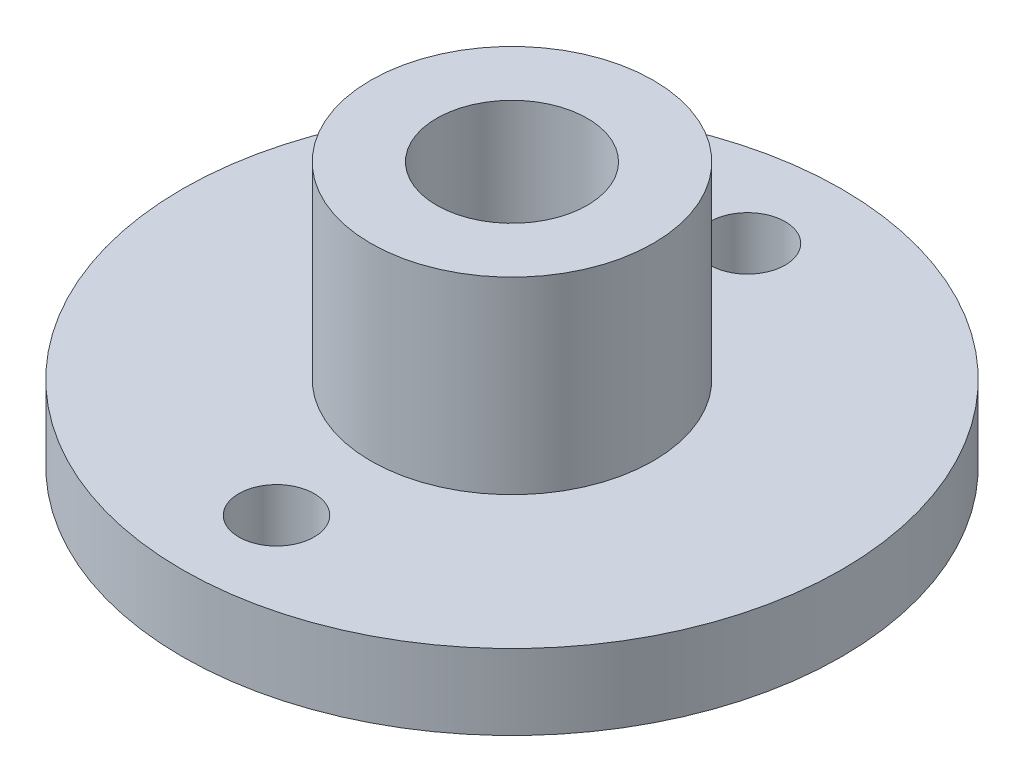
ISO-10303-21;
HEADER;
FILE_DESCRIPTION(('STEP AP214'),'2;1');
FILE_NAME('part.step','',(''),(''),'','','');
FILE_SCHEMA(('AUTOMOTIVE_DESIGN { 1 0 10303 214 1 1 1 1 }'));
ENDSEC;
DATA;
#1=APPLICATION_CONTEXT('core data for automotive mechanical design processes');
#2=APPLICATION_PROTOCOL_DEFINITION('international standard','automotive_design',2000,#1);
#3=PRODUCT_CONTEXT('',#1,'mechanical');
#4=PRODUCT('Part','Part','',(#3));
#5=PRODUCT_RELATED_PRODUCT_CATEGORY('part','',(#4));
#6=PRODUCT_DEFINITION_FORMATION('','',#4);
#7=PRODUCT_DEFINITION_CONTEXT('part definition',#1,'design');
#8=PRODUCT_DEFINITION('design','',#6,#7);
#9=PRODUCT_DEFINITION_SHAPE('','',#8);
#10=(LENGTH_UNIT() NAMED_UNIT(*) SI_UNIT(.MILLI.,.METRE.));
#11=(NAMED_UNIT(*) PLANE_ANGLE_UNIT() SI_UNIT($,.RADIAN.));
#12=(NAMED_UNIT(*) SI_UNIT($,.STERADIAN.) SOLID_ANGLE_UNIT());
#13=UNCERTAINTY_MEASURE_WITH_UNIT(LENGTH_MEASURE(1.E-05),#10,'distance_accuracy_value','');
#14=(GEOMETRIC_REPRESENTATION_CONTEXT(3) GLOBAL_UNCERTAINTY_ASSIGNED_CONTEXT((#13)) GLOBAL_UNIT_ASSIGNED_CONTEXT((#10,
#11,#12)) REPRESENTATION_CONTEXT('',''));
#15=CARTESIAN_POINT('',(0.,0.,0.));
#16=DIRECTION('',(0.,0.,1.));
#17=DIRECTION('',(1.,0.,0.));
#18=AXIS2_PLACEMENT_3D('',#15,#16,#17);
#19=CARTESIAN_POINT('',(0.,4.,0.));
#20=DIRECTION('',(0.,1.,0.));
#21=DIRECTION('',(0.,0.,1.));
#22=AXIS2_PLACEMENT_3D('',#19,#20,#21);
#23=PLANE('',#22);
#24=CARTESIAN_POINT('',(0.,4.,0.));
#25=DIRECTION('',(0.,1.,0.));
#26=DIRECTION('',(0.,0.,1.));
#27=AXIS2_PLACEMENT_3D('',#24,#25,#26);
#28=CIRCLE('',#27,7.5);
#29=CARTESIAN_POINT('',(0.,4.,7.5));
#30=VERTEX_POINT('',#29);
#31=EDGE_CURVE('E64',#30,#30,#28,.T.);
#32=ORIENTED_EDGE('',*,*,#31,.F.);
#33=EDGE_LOOP('',(#32));
#34=FACE_BOUND('',#33,.T.);
#35=CARTESIAN_POINT('',(0.,4.,-12.5));
#36=DIRECTION('',(0.,1.,0.));
#37=DIRECTION('',(0.,0.,1.));
#38=AXIS2_PLACEMENT_3D('',#35,#36,#37);
#39=CIRCLE('',#38,2.);
#40=CARTESIAN_POINT('',(0.,4.,-10.5));
#41=VERTEX_POINT('',#40);
#42=EDGE_CURVE('E50',#41,#41,#39,.T.);
#43=ORIENTED_EDGE('',*,*,#42,.F.);
#44=EDGE_LOOP('',(#43));
#45=FACE_BOUND('',#44,.T.);
#46=CARTESIAN_POINT('',(0.,4.,0.));
#47=DIRECTION('',(0.,1.,0.));
#48=DIRECTION('',(0.,0.,1.));
#49=AXIS2_PLACEMENT_3D('',#46,#47,#48);
#50=CIRCLE('',#49,17.5);
#51=CARTESIAN_POINT('',(0.,4.,17.5));
#52=VERTEX_POINT('',#51);
#53=EDGE_CURVE('E41',#52,#52,#50,.T.);
#54=ORIENTED_EDGE('',*,*,#53,.T.);
#55=EDGE_LOOP('',(#54));
#56=FACE_BOUND('',#55,.T.);
#57=CARTESIAN_POINT('',(0.,4.,12.5));
#58=DIRECTION('',(0.,1.,0.));
#59=DIRECTION('',(0.,0.,1.));
#60=AXIS2_PLACEMENT_3D('',#57,#58,#59);
#61=CIRCLE('',#60,2.);
#62=CARTESIAN_POINT('',(0.,4.,14.5));
#63=VERTEX_POINT('',#62);
#64=EDGE_CURVE('E55',#63,#63,#61,.T.);
#65=ORIENTED_EDGE('',*,*,#64,.F.);
#66=EDGE_LOOP('',(#65));
#67=FACE_BOUND('',#66,.T.);
#68=ADVANCED_FACE('F34',(#34,#45,#56,#67),#23,.T.);
#69=CARTESIAN_POINT('',(0.,0.,0.));
#70=DIRECTION('',(0.,1.,0.));
#71=DIRECTION('',(0.,0.,1.));
#72=AXIS2_PLACEMENT_3D('',#69,#70,#71);
#73=PLANE('',#72);
#74=CARTESIAN_POINT('',(0.,0.,0.));
#75=DIRECTION('',(0.,1.,0.));
#76=DIRECTION('',(0.,0.,1.));
#77=AXIS2_PLACEMENT_3D('',#74,#75,#76);
#78=CIRCLE('',#77,17.5);
#79=CARTESIAN_POINT('',(0.,0.,17.5));
#80=VERTEX_POINT('',#79);
#81=EDGE_CURVE('E45',#80,#80,#78,.T.);
#82=ORIENTED_EDGE('',*,*,#81,.F.);
#83=EDGE_LOOP('',(#82));
#84=FACE_BOUND('',#83,.T.);
#85=CARTESIAN_POINT('',(0.,0.,-12.5));
#86=DIRECTION('',(0.,1.,0.));
#87=DIRECTION('',(0.,0.,1.));
#88=AXIS2_PLACEMENT_3D('',#85,#86,#87);
#89=CIRCLE('',#88,2.);
#90=CARTESIAN_POINT('',(0.,0.,-10.5));
#91=VERTEX_POINT('',#90);
#92=EDGE_CURVE('E52',#91,#91,#89,.T.);
#93=ORIENTED_EDGE('',*,*,#92,.T.);
#94=EDGE_LOOP('',(#93));
#95=FACE_BOUND('',#94,.T.);
#96=CARTESIAN_POINT('',(0.,0.,12.5));
#97=DIRECTION('',(0.,1.,0.));
#98=DIRECTION('',(0.,0.,1.));
#99=AXIS2_PLACEMENT_3D('',#96,#97,#98);
#100=CIRCLE('',#99,2.);
#101=CARTESIAN_POINT('',(0.,0.,14.5));
#102=VERTEX_POINT('',#101);
#103=EDGE_CURVE('E58',#102,#102,#100,.T.);
#104=ORIENTED_EDGE('',*,*,#103,.T.);
#105=EDGE_LOOP('',(#104));
#106=FACE_BOUND('',#105,.T.);
#107=ADVANCED_FACE('F92',(#84,#95,#106),#73,.F.);
#108=CARTESIAN_POINT('',(0.,4.,0.));
#109=DIRECTION('',(0.,-1.,0.));
#110=DIRECTION('',(0.,0.,-1.));
#111=AXIS2_PLACEMENT_3D('',#108,#109,#110);
#112=CYLINDRICAL_SURFACE('',#111,17.5);
#113=ORIENTED_EDGE('',*,*,#53,.F.);
#114=EDGE_LOOP('',(#113));
#115=FACE_BOUND('',#114,.T.);
#116=ORIENTED_EDGE('',*,*,#81,.T.);
#117=EDGE_LOOP('',(#116));
#118=FACE_BOUND('',#117,.T.);
#119=ADVANCED_FACE('F36',(#115,#118),#112,.T.);
#120=CARTESIAN_POINT('',(0.,4.,-12.5));
#121=DIRECTION('',(0.,-1.,0.));
#122=DIRECTION('',(0.,0.,-1.));
#123=AXIS2_PLACEMENT_3D('',#120,#121,#122);
#124=CYLINDRICAL_SURFACE('',#123,2.);
#125=ORIENTED_EDGE('',*,*,#42,.T.);
#126=EDGE_LOOP('',(#125));
#127=FACE_BOUND('',#126,.T.);
#128=ORIENTED_EDGE('',*,*,#92,.F.);
#129=EDGE_LOOP('',(#128));
#130=FACE_BOUND('',#129,.T.);
#131=ADVANCED_FACE('F87',(#127,#130),#124,.F.);
#132=CARTESIAN_POINT('',(0.,4.,12.5));
#133=DIRECTION('',(0.,-1.,0.));
#134=DIRECTION('',(0.,0.,-1.));
#135=AXIS2_PLACEMENT_3D('',#132,#133,#134);
#136=CYLINDRICAL_SURFACE('',#135,2.);
#137=ORIENTED_EDGE('',*,*,#64,.T.);
#138=EDGE_LOOP('',(#137));
#139=FACE_BOUND('',#138,.T.);
#140=ORIENTED_EDGE('',*,*,#103,.F.);
#141=EDGE_LOOP('',(#140));
#142=FACE_BOUND('',#141,.T.);
#143=ADVANCED_FACE('F78',(#139,#142),#136,.F.);
#144=CARTESIAN_POINT('',(0.,14.,0.));
#145=DIRECTION('',(0.,1.,0.));
#146=DIRECTION('',(0.,0.,1.));
#147=AXIS2_PLACEMENT_3D('',#144,#145,#146);
#148=PLANE('',#147);
#149=CARTESIAN_POINT('',(0.,14.,0.));
#150=DIRECTION('',(0.,1.,0.));
#151=DIRECTION('',(0.,0.,1.));
#152=AXIS2_PLACEMENT_3D('',#149,#150,#151);
#153=CIRCLE('',#152,7.5);
#154=CARTESIAN_POINT('',(0.,14.,7.5));
#155=VERTEX_POINT('',#154);
#156=EDGE_CURVE('E61',#155,#155,#153,.T.);
#157=ORIENTED_EDGE('',*,*,#156,.T.);
#158=EDGE_LOOP('',(#157));
#159=FACE_BOUND('',#158,.T.);
#160=CARTESIAN_POINT('',(0.,14.,0.));
#161=DIRECTION('',(0.,1.,0.));
#162=DIRECTION('',(0.,0.,1.));
#163=AXIS2_PLACEMENT_3D('',#160,#161,#162);
#164=CIRCLE('',#163,4.);
#165=CARTESIAN_POINT('',(0.,14.,4.));
#166=VERTEX_POINT('',#165);
#167=EDGE_CURVE('E67',#166,#166,#164,.T.);
#168=ORIENTED_EDGE('',*,*,#167,.F.);
#169=EDGE_LOOP('',(#168));
#170=FACE_BOUND('',#169,.T.);
#171=ADVANCED_FACE('F75',(#159,#170),#148,.T.);
#172=CARTESIAN_POINT('',(0.,14.,0.));
#173=DIRECTION('',(0.,-1.,0.));
#174=DIRECTION('',(0.,0.,-1.));
#175=AXIS2_PLACEMENT_3D('',#172,#173,#174);
#176=CYLINDRICAL_SURFACE('',#175,7.5);
#177=ORIENTED_EDGE('',*,*,#156,.F.);
#178=EDGE_LOOP('',(#177));
#179=FACE_BOUND('',#178,.T.);
#180=ORIENTED_EDGE('',*,*,#31,.T.);
#181=EDGE_LOOP('',(#180));
#182=FACE_BOUND('',#181,.T.);
#183=ADVANCED_FACE('F77',(#179,#182),#176,.T.);
#184=CARTESIAN_POINT('',(0.,14.,0.));
#185=DIRECTION('',(0.,-1.,0.));
#186=DIRECTION('',(0.,0.,-1.));
#187=AXIS2_PLACEMENT_3D('',#184,#185,#186);
#188=CYLINDRICAL_SURFACE('',#187,4.);
#189=ORIENTED_EDGE('',*,*,#167,.T.);
#190=EDGE_LOOP('',(#189));
#191=FACE_BOUND('',#190,.T.);
#192=CARTESIAN_POINT('',(0.,4.,0.));
#193=DIRECTION('',(0.,1.,0.));
#194=DIRECTION('',(0.,0.,1.));
#195=AXIS2_PLACEMENT_3D('',#192,#193,#194);
#196=CIRCLE('',#195,4.);
#197=CARTESIAN_POINT('',(0.,4.,4.));
#198=VERTEX_POINT('',#197);
#199=EDGE_CURVE('E10',#198,#198,#196,.F.);
#200=ORIENTED_EDGE('',*,*,#199,.T.);
#201=EDGE_LOOP('',(#200));
#202=FACE_BOUND('',#201,.T.);
#203=ADVANCED_FACE('F73',(#191,#202),#188,.F.);
#204=ORIENTED_EDGE('',*,*,#199,.F.);
#205=EDGE_LOOP('',(#204));
#206=FACE_BOUND('',#205,.T.);
#207=ADVANCED_FACE('F95',(#206),#23,.T.);
#208=CLOSED_SHELL('',(#68,#107,#119,#131,#143,#171,#183,#203,#207));
#209=MANIFOLD_SOLID_BREP('B2',#208);
#210=ADVANCED_BREP_SHAPE_REPRESENTATION('',(#18,#209),#14);
#211=SHAPE_DEFINITION_REPRESENTATION(#9,#210);
ENDSEC;
END-ISO-10303-21;
